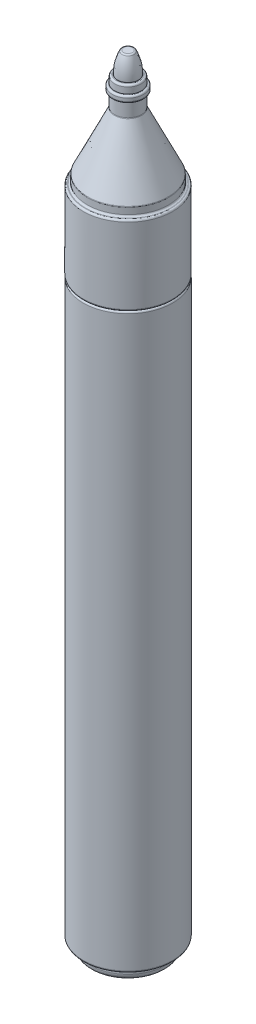
ISO-10303-21;
HEADER;
FILE_DESCRIPTION(('STEP AP214'),'2;1');
FILE_NAME('part.step','',(''),(''),'','','');
FILE_SCHEMA(('AUTOMOTIVE_DESIGN { 1 0 10303 214 1 1 1 1 }'));
ENDSEC;
DATA;
#1=APPLICATION_CONTEXT('core data for automotive mechanical design processes');
#2=APPLICATION_PROTOCOL_DEFINITION('international standard','automotive_design',2000,#1);
#3=PRODUCT_CONTEXT('',#1,'mechanical');
#4=PRODUCT('Part','Part','',(#3));
#5=PRODUCT_RELATED_PRODUCT_CATEGORY('part','',(#4));
#6=PRODUCT_DEFINITION_FORMATION('','',#4);
#7=PRODUCT_DEFINITION_CONTEXT('part definition',#1,'design');
#8=PRODUCT_DEFINITION('design','',#6,#7);
#9=PRODUCT_DEFINITION_SHAPE('','',#8);
#10=(LENGTH_UNIT() NAMED_UNIT(*) SI_UNIT(.MILLI.,.METRE.));
#11=(NAMED_UNIT(*) PLANE_ANGLE_UNIT() SI_UNIT($,.RADIAN.));
#12=(NAMED_UNIT(*) SI_UNIT($,.STERADIAN.) SOLID_ANGLE_UNIT());
#13=UNCERTAINTY_MEASURE_WITH_UNIT(LENGTH_MEASURE(1.E-05),#10,'distance_accuracy_value','');
#14=(GEOMETRIC_REPRESENTATION_CONTEXT(3) GLOBAL_UNCERTAINTY_ASSIGNED_CONTEXT((#13)) GLOBAL_UNIT_ASSIGNED_CONTEXT((#10,
#11,#12)) REPRESENTATION_CONTEXT('',''));
#15=CARTESIAN_POINT('',(0.,0.,0.));
#16=DIRECTION('',(0.,0.,1.));
#17=DIRECTION('',(1.,0.,0.));
#18=AXIS2_PLACEMENT_3D('',#15,#16,#17);
#19=CARTESIAN_POINT('',(0.,128.676956490786,0.));
#20=DIRECTION('',(0.,1.,0.));
#21=DIRECTION('',(0.,0.,1.));
#22=AXIS2_PLACEMENT_3D('',#19,#20,#21);
#23=PLANE('',#22);
#24=CARTESIAN_POINT('',(0.,128.676956490786,0.));
#25=DIRECTION('',(0.,1.,0.));
#26=DIRECTION('',(0.,0.,1.));
#27=AXIS2_PLACEMENT_3D('',#24,#25,#26);
#28=CIRCLE('',#27,0.732183424165414);
#29=CARTESIAN_POINT('',(0.,128.676956490786,0.732183424165414));
#30=VERTEX_POINT('',#29);
#31=EDGE_CURVE('E53',#30,#30,#28,.T.);
#32=ORIENTED_EDGE('',*,*,#31,.T.);
#33=EDGE_LOOP('',(#32));
#34=FACE_BOUND('',#33,.T.);
#35=ADVANCED_FACE('F42',(#34),#23,.T.);
#36=CARTESIAN_POINT('',(0.,96.,0.));
#37=DIRECTION('',(0.,-1.,0.));
#38=DIRECTION('',(0.,0.,-1.));
#39=AXIS2_PLACEMENT_3D('',#36,#37,#38);
#40=PLANE('',#39);
#41=CARTESIAN_POINT('',(0.,96.,0.));
#42=DIRECTION('',(0.,-1.,0.));
#43=DIRECTION('',(0.,0.,-1.));
#44=AXIS2_PLACEMENT_3D('',#41,#42,#43);
#45=CIRCLE('',#44,7.2);
#46=CARTESIAN_POINT('',(0.,96.,-7.2));
#47=VERTEX_POINT('',#46);
#48=EDGE_CURVE('E101',#47,#47,#45,.T.);
#49=ORIENTED_EDGE('',*,*,#48,.T.);
#50=EDGE_LOOP('',(#49));
#51=FACE_BOUND('',#50,.T.);
#52=ADVANCED_FACE('F183',(#51),#40,.T.);
#53=CARTESIAN_POINT('',(0.,96.,0.));
#54=DIRECTION('',(0.,-1.,0.));
#55=DIRECTION('',(0.,0.,-1.));
#56=AXIS2_PLACEMENT_3D('',#53,#54,#55);
#57=CYLINDRICAL_SURFACE('',#56,7.5);
#58=CARTESIAN_POINT('',(0.,108.986737814818,0.));
#59=DIRECTION('',(0.,1.,0.));
#60=DIRECTION('',(0.,0.,1.));
#61=AXIS2_PLACEMENT_3D('',#58,#59,#60);
#62=CIRCLE('',#61,7.5);
#63=CARTESIAN_POINT('',(0.,108.986737814818,7.5));
#64=VERTEX_POINT('',#63);
#65=EDGE_CURVE('E95',#64,#64,#62,.F.);
#66=ORIENTED_EDGE('',*,*,#65,.T.);
#67=EDGE_LOOP('',(#66));
#68=FACE_BOUND('',#67,.T.);
#69=CARTESIAN_POINT('',(0.,96.3,0.));
#70=DIRECTION('',(0.,-1.,0.));
#71=DIRECTION('',(0.,0.,-1.));
#72=AXIS2_PLACEMENT_3D('',#69,#70,#71);
#73=CIRCLE('',#72,7.5);
#74=CARTESIAN_POINT('',(0.,96.3,-7.5));
#75=VERTEX_POINT('',#74);
#76=EDGE_CURVE('E98',#75,#75,#73,.F.);
#77=ORIENTED_EDGE('',*,*,#76,.T.);
#78=EDGE_LOOP('',(#77));
#79=FACE_BOUND('',#78,.T.);
#80=ADVANCED_FACE('F179',(#68,#79),#57,.T.);
#81=CARTESIAN_POINT('',(7.5,109.286737814818,0.));
#82=DIRECTION('',(0.,1.,0.));
#83=DIRECTION('',(0.,0.,1.));
#84=AXIS2_PLACEMENT_3D('',#81,#82,#83);
#85=PLANE('',#84);
#86=CARTESIAN_POINT('',(0.,109.286737814818,0.));
#87=DIRECTION('',(0.,1.,0.));
#88=DIRECTION('',(0.,0.,1.));
#89=AXIS2_PLACEMENT_3D('',#86,#87,#88);
#90=CIRCLE('',#89,7.2);
#91=CARTESIAN_POINT('',(0.,109.286737814818,7.2));
#92=VERTEX_POINT('',#91);
#93=EDGE_CURVE('E89',#92,#92,#90,.T.);
#94=ORIENTED_EDGE('',*,*,#93,.T.);
#95=EDGE_LOOP('',(#94));
#96=FACE_BOUND('',#95,.T.);
#97=CARTESIAN_POINT('',(0.,109.286737814818,0.));
#98=DIRECTION('',(0.,1.,0.));
#99=DIRECTION('',(0.,0.,1.));
#100=AXIS2_PLACEMENT_3D('',#97,#98,#99);
#101=CIRCLE('',#100,7.09439131075038);
#102=CARTESIAN_POINT('',(0.,109.286737814818,7.09439131075038));
#103=VERTEX_POINT('',#102);
#104=EDGE_CURVE('E92',#103,#103,#101,.F.);
#105=ORIENTED_EDGE('',*,*,#104,.T.);
#106=EDGE_LOOP('',(#105));
#107=FACE_BOUND('',#106,.T.);
#108=ADVANCED_FACE('F175',(#96,#107),#85,.T.);
#109=CARTESIAN_POINT('',(0.,96.,0.));
#110=DIRECTION('',(0.,-1.,0.));
#111=DIRECTION('',(0.,0.,-1.));
#112=AXIS2_PLACEMENT_3D('',#109,#110,#111);
#113=CYLINDRICAL_SURFACE('',#112,6.79439131075038);
#114=CARTESIAN_POINT('',(0.,109.586737814818,0.));
#115=DIRECTION('',(0.,1.,0.));
#116=DIRECTION('',(0.,0.,1.));
#117=AXIS2_PLACEMENT_3D('',#114,#115,#116);
#118=CIRCLE('',#117,6.79439131075038);
#119=CARTESIAN_POINT('',(0.,109.586737814818,6.79439131075038));
#120=VERTEX_POINT('',#119);
#121=EDGE_CURVE('E83',#120,#120,#118,.T.);
#122=ORIENTED_EDGE('',*,*,#121,.T.);
#123=EDGE_LOOP('',(#122));
#124=FACE_BOUND('',#123,.T.);
#125=CARTESIAN_POINT('',(0.,110.648031964305,0.));
#126=DIRECTION('',(0.,1.,0.));
#127=DIRECTION('',(0.,0.,1.));
#128=AXIS2_PLACEMENT_3D('',#125,#126,#127);
#129=CIRCLE('',#128,6.79439131075038);
#130=CARTESIAN_POINT('',(0.,110.648031964305,6.79439131075038));
#131=VERTEX_POINT('',#130);
#132=EDGE_CURVE('E86',#131,#131,#129,.F.);
#133=ORIENTED_EDGE('',*,*,#132,.T.);
#134=EDGE_LOOP('',(#133));
#135=FACE_BOUND('',#134,.T.);
#136=ADVANCED_FACE('F171',(#124,#135),#113,.T.);
#137=CARTESIAN_POINT('',(0.,110.715390157732,0.));
#138=DIRECTION('',(0.,-1.,0.));
#139=DIRECTION('',(0.,0.,-1.));
#140=AXIS2_PLACEMENT_3D('',#137,#138,#139);
#141=CONICAL_SURFACE('',#140,6.79439131075038,0.441728970068027);
#142=CARTESIAN_POINT('',(0.,110.776282899163,0.));
#143=DIRECTION('',(0.,1.,0.));
#144=DIRECTION('',(0.,0.,1.));
#145=AXIS2_PLACEMENT_3D('',#142,#143,#144);
#146=CIRCLE('',#145,6.76559547315956);
#147=CARTESIAN_POINT('',(0.,110.776282899163,6.76559547315956));
#148=VERTEX_POINT('',#147);
#149=EDGE_CURVE('E77',#148,#148,#146,.T.);
#150=ORIENTED_EDGE('',*,*,#149,.T.);
#151=EDGE_LOOP('',(#150));
#152=FACE_BOUND('',#151,.T.);
#153=CARTESIAN_POINT('',(0.,120.295442190176,0.));
#154=DIRECTION('',(0.,-1.,0.));
#155=DIRECTION('',(0.,0.,-1.));
#156=AXIS2_PLACEMENT_3D('',#153,#154,#155);
#157=CIRCLE('',#156,2.2640381692862);
#158=CARTESIAN_POINT('',(0.,120.295442190176,-2.2640381692862));
#159=VERTEX_POINT('',#158);
#160=EDGE_CURVE('E80',#159,#159,#157,.T.);
#161=ORIENTED_EDGE('',*,*,#160,.T.);
#162=EDGE_LOOP('',(#161));
#163=FACE_BOUND('',#162,.T.);
#164=ADVANCED_FACE('F167',(#152,#163),#141,.T.);
#165=CARTESIAN_POINT('',(0.,96.,0.));
#166=DIRECTION('',(0.,-1.,0.));
#167=DIRECTION('',(0.,0.,-1.));
#168=AXIS2_PLACEMENT_3D('',#165,#166,#167);
#169=CYLINDRICAL_SURFACE('',#168,2.23524233169538);
#170=CARTESIAN_POINT('',(0.,120.423693125034,0.));
#171=DIRECTION('',(0.,-1.,0.));
#172=DIRECTION('',(0.,0.,-1.));
#173=AXIS2_PLACEMENT_3D('',#170,#171,#172);
#174=CIRCLE('',#173,2.23524233169538);
#175=CARTESIAN_POINT('',(0.,120.423693125034,-2.23524233169538));
#176=VERTEX_POINT('',#175);
#177=EDGE_CURVE('E74',#176,#176,#174,.F.);
#178=ORIENTED_EDGE('',*,*,#177,.T.);
#179=EDGE_LOOP('',(#178));
#180=FACE_BOUND('',#179,.T.);
#181=CARTESIAN_POINT('',(0.,122.754171915762,0.));
#182=DIRECTION('',(0.,-1.,0.));
#183=DIRECTION('',(0.,0.,-1.));
#184=AXIS2_PLACEMENT_3D('',#181,#182,#183);
#185=CIRCLE('',#184,2.23524233169538);
#186=CARTESIAN_POINT('',(0.,122.754171915762,-2.23524233169538));
#187=VERTEX_POINT('',#186);
#188=EDGE_CURVE('E104',#187,#187,#185,.T.);
#189=ORIENTED_EDGE('',*,*,#188,.T.);
#190=EDGE_LOOP('',(#189));
#191=FACE_BOUND('',#190,.T.);
#192=ADVANCED_FACE('F163',(#180,#191),#169,.T.);
#193=CARTESIAN_POINT('',(2.23524233169538,122.754171915762,0.));
#194=DIRECTION('',(0.,-1.,0.));
#195=DIRECTION('',(0.,0.,-1.));
#196=AXIS2_PLACEMENT_3D('',#193,#194,#195);
#197=PLANE('',#196);
#198=CARTESIAN_POINT('',(0.,122.754171915762,0.));
#199=DIRECTION('',(0.,-1.,0.));
#200=DIRECTION('',(0.,0.,-1.));
#201=AXIS2_PLACEMENT_3D('',#198,#199,#200);
#202=CIRCLE('',#201,2.33765852115577);
#203=CARTESIAN_POINT('',(0.,122.754171915762,-2.33765852115577));
#204=VERTEX_POINT('',#203);
#205=EDGE_CURVE('E71',#204,#204,#202,.T.);
#206=ORIENTED_EDGE('',*,*,#205,.T.);
#207=EDGE_LOOP('',(#206));
#208=FACE_BOUND('',#207,.T.);
#209=ORIENTED_EDGE('',*,*,#188,.F.);
#210=EDGE_LOOP('',(#209));
#211=FACE_BOUND('',#210,.T.);
#212=ADVANCED_FACE('F159',(#208,#211),#197,.T.);
#213=CARTESIAN_POINT('',(0.,96.,0.));
#214=DIRECTION('',(0.,-1.,0.));
#215=DIRECTION('',(0.,0.,-1.));
#216=AXIS2_PLACEMENT_3D('',#213,#214,#215);
#217=CYLINDRICAL_SURFACE('',#216,2.63765852115577);
#218=CARTESIAN_POINT('',(0.,123.054171915762,0.));
#219=DIRECTION('',(0.,-1.,0.));
#220=DIRECTION('',(0.,0.,-1.));
#221=AXIS2_PLACEMENT_3D('',#218,#219,#220);
#222=CIRCLE('',#221,2.63765852115577);
#223=CARTESIAN_POINT('',(0.,123.054171915762,-2.63765852115577));
#224=VERTEX_POINT('',#223);
#225=EDGE_CURVE('E65',#224,#224,#222,.F.);
#226=ORIENTED_EDGE('',*,*,#225,.T.);
#227=EDGE_LOOP('',(#226));
#228=FACE_BOUND('',#227,.T.);
#229=CARTESIAN_POINT('',(0.,123.559216575199,0.));
#230=DIRECTION('',(0.,1.,0.));
#231=DIRECTION('',(0.,0.,1.));
#232=AXIS2_PLACEMENT_3D('',#229,#230,#231);
#233=CIRCLE('',#232,2.63765852115577);
#234=CARTESIAN_POINT('',(0.,123.559216575199,2.63765852115577));
#235=VERTEX_POINT('',#234);
#236=EDGE_CURVE('E68',#235,#235,#233,.F.);
#237=ORIENTED_EDGE('',*,*,#236,.T.);
#238=EDGE_LOOP('',(#237));
#239=FACE_BOUND('',#238,.T.);
#240=ADVANCED_FACE('F155',(#228,#239),#217,.T.);
#241=CARTESIAN_POINT('',(2.63765852115577,123.859216575199,0.));
#242=DIRECTION('',(0.,1.,0.));
#243=DIRECTION('',(0.,0.,1.));
#244=AXIS2_PLACEMENT_3D('',#241,#242,#243);
#245=PLANE('',#244);
#246=CARTESIAN_POINT('',(0.,123.859216575199,0.));
#247=DIRECTION('',(0.,1.,0.));
#248=DIRECTION('',(0.,0.,1.));
#249=AXIS2_PLACEMENT_3D('',#246,#247,#248);
#250=CIRCLE('',#249,2.33765852115577);
#251=CARTESIAN_POINT('',(0.,123.859216575199,2.33765852115577));
#252=VERTEX_POINT('',#251);
#253=EDGE_CURVE('E62',#252,#252,#250,.T.);
#254=ORIENTED_EDGE('',*,*,#253,.T.);
#255=EDGE_LOOP('',(#254));
#256=FACE_BOUND('',#255,.T.);
#257=CARTESIAN_POINT('',(0.,123.859216575199,0.));
#258=DIRECTION('',(0.,-1.,0.));
#259=DIRECTION('',(0.,0.,-1.));
#260=AXIS2_PLACEMENT_3D('',#257,#258,#259);
#261=CIRCLE('',#260,2.23524233169538);
#262=CARTESIAN_POINT('',(0.,123.859216575199,-2.23524233169538));
#263=VERTEX_POINT('',#262);
#264=EDGE_CURVE('E107',#263,#263,#261,.T.);
#265=ORIENTED_EDGE('',*,*,#264,.T.);
#266=EDGE_LOOP('',(#265));
#267=FACE_BOUND('',#266,.T.);
#268=ADVANCED_FACE('F152',(#256,#267),#245,.T.);
#269=CARTESIAN_POINT('',(0.,96.,0.));
#270=DIRECTION('',(0.,-1.,0.));
#271=DIRECTION('',(0.,0.,-1.));
#272=AXIS2_PLACEMENT_3D('',#269,#270,#271);
#273=CYLINDRICAL_SURFACE('',#272,2.23524233169538);
#274=CARTESIAN_POINT('',(0.,124.887686929379,0.));
#275=DIRECTION('',(0.,1.,0.));
#276=DIRECTION('',(0.,0.,1.));
#277=AXIS2_PLACEMENT_3D('',#274,#275,#276);
#278=CIRCLE('',#277,2.23524233169538);
#279=CARTESIAN_POINT('',(0.,124.887686929379,2.23524233169538));
#280=VERTEX_POINT('',#279);
#281=EDGE_CURVE('E49',#280,#280,#278,.F.);
#282=ORIENTED_EDGE('',*,*,#281,.T.);
#283=EDGE_LOOP('',(#282));
#284=FACE_BOUND('',#283,.T.);
#285=ORIENTED_EDGE('',*,*,#264,.F.);
#286=EDGE_LOOP('',(#285));
#287=FACE_BOUND('',#286,.T.);
#288=ADVANCED_FACE('F149',(#284,#287),#273,.T.);
#289=CARTESIAN_POINT('',(2.23524233169538,125.187686929379,0.));
#290=DIRECTION('',(0.,1.,0.));
#291=DIRECTION('',(0.,0.,1.));
#292=AXIS2_PLACEMENT_3D('',#289,#290,#291);
#293=PLANE('',#292);
#294=CARTESIAN_POINT('',(0.,125.187686929379,0.));
#295=DIRECTION('',(0.,1.,0.));
#296=DIRECTION('',(0.,0.,1.));
#297=AXIS2_PLACEMENT_3D('',#294,#295,#296);
#298=CIRCLE('',#297,1.93524233169538);
#299=CARTESIAN_POINT('',(0.,125.187686929379,1.93524233169538));
#300=VERTEX_POINT('',#299);
#301=EDGE_CURVE('E11',#300,#300,#298,.T.);
#302=ORIENTED_EDGE('',*,*,#301,.T.);
#303=EDGE_LOOP('',(#302));
#304=FACE_BOUND('',#303,.T.);
#305=CARTESIAN_POINT('',(0.,125.187686929379,0.));
#306=DIRECTION('',(0.,-1.,0.));
#307=DIRECTION('',(0.,0.,-1.));
#308=AXIS2_PLACEMENT_3D('',#305,#306,#307);
#309=CIRCLE('',#308,1.77215292040047);
#310=CARTESIAN_POINT('',(0.,125.187686929379,-1.77215292040047));
#311=VERTEX_POINT('',#310);
#312=EDGE_CURVE('E110',#311,#311,#309,.T.);
#313=ORIENTED_EDGE('',*,*,#312,.T.);
#314=EDGE_LOOP('',(#313));
#315=FACE_BOUND('',#314,.T.);
#316=ADVANCED_FACE('F145',(#304,#315),#293,.T.);
#317=CARTESIAN_POINT('',(0.,96.,0.));
#318=DIRECTION('',(0.,-1.,0.));
#319=DIRECTION('',(0.,0.,-1.));
#320=AXIS2_PLACEMENT_3D('',#317,#318,#319);
#321=CYLINDRICAL_SURFACE('',#320,1.77215292040047);
#322=CARTESIAN_POINT('',(0.,124.527585577157,0.));
#323=DIRECTION('',(0.,-1.,0.));
#324=DIRECTION('',(0.,0.,-1.));
#325=AXIS2_PLACEMENT_3D('',#322,#323,#324);
#326=CIRCLE('',#325,1.77215292040047);
#327=CARTESIAN_POINT('',(0.,124.527585577157,-1.77215292040047));
#328=VERTEX_POINT('',#327);
#329=EDGE_CURVE('E113',#328,#328,#326,.T.);
#330=ORIENTED_EDGE('',*,*,#329,.T.);
#331=EDGE_LOOP('',(#330));
#332=FACE_BOUND('',#331,.T.);
#333=ORIENTED_EDGE('',*,*,#312,.F.);
#334=EDGE_LOOP('',(#333));
#335=FACE_BOUND('',#334,.T.);
#336=ADVANCED_FACE('F141',(#332,#335),#321,.F.);
#337=CARTESIAN_POINT('',(1.71169839944116,124.527585577157,0.));
#338=DIRECTION('',(0.,1.,0.));
#339=DIRECTION('',(0.,0.,1.));
#340=AXIS2_PLACEMENT_3D('',#337,#338,#339);
#341=PLANE('',#340);
#342=CARTESIAN_POINT('',(0.,124.527585577157,0.));
#343=DIRECTION('',(0.,-1.,0.));
#344=DIRECTION('',(0.,0.,-1.));
#345=AXIS2_PLACEMENT_3D('',#342,#343,#344);
#346=CIRCLE('',#345,1.71169839944116);
#347=CARTESIAN_POINT('',(0.,124.527585577157,-1.71169839944116));
#348=VERTEX_POINT('',#347);
#349=EDGE_CURVE('E116',#348,#348,#346,.T.);
#350=ORIENTED_EDGE('',*,*,#349,.T.);
#351=EDGE_LOOP('',(#350));
#352=FACE_BOUND('',#351,.T.);
#353=ORIENTED_EDGE('',*,*,#329,.F.);
#354=EDGE_LOOP('',(#353));
#355=FACE_BOUND('',#354,.T.);
#356=ADVANCED_FACE('F137',(#352,#355),#341,.T.);
#357=CARTESIAN_POINT('',(0.,96.,0.));
#358=DIRECTION('',(0.,-1.,0.));
#359=DIRECTION('',(0.,0.,-1.));
#360=AXIS2_PLACEMENT_3D('',#357,#358,#359);
#361=CYLINDRICAL_SURFACE('',#360,1.71169839944116);
#362=CARTESIAN_POINT('',(0.,125.187686929379,0.));
#363=DIRECTION('',(0.,-1.,0.));
#364=DIRECTION('',(0.,0.,-1.));
#365=AXIS2_PLACEMENT_3D('',#362,#363,#364);
#366=CIRCLE('',#365,1.71169839944116);
#367=CARTESIAN_POINT('',(0.,125.187686929379,-1.71169839944116));
#368=VERTEX_POINT('',#367);
#369=EDGE_CURVE('E119',#368,#368,#366,.T.);
#370=ORIENTED_EDGE('',*,*,#369,.T.);
#371=EDGE_LOOP('',(#370));
#372=FACE_BOUND('',#371,.T.);
#373=ORIENTED_EDGE('',*,*,#349,.F.);
#374=EDGE_LOOP('',(#373));
#375=FACE_BOUND('',#374,.T.);
#376=ADVANCED_FACE('F133',(#372,#375),#361,.T.);
#377=CARTESIAN_POINT('',(1.71169839944116,125.187686929379,0.));
#378=CARTESIAN_POINT('',(1.75693190432987,126.488456162657,0.));
#379=CARTESIAN_POINT('',(1.48976738983345,127.651546016572,0.));
#380=CARTESIAN_POINT('',(0.91020485614761,128.676956490786,0.));
#381=B_SPLINE_CURVE_WITH_KNOTS('',3,(#377,#378,#379,#380),.UNSPECIFIED.,.F.,.F.,(4,4),
(0.298630267274512,1.),.UNSPECIFIED.);
#382=CARTESIAN_POINT('',(0.,96.,0.));
#383=DIRECTION('',(0.,-1.,0.));
#384=AXIS1_PLACEMENT('',#382,#383);
#385=SURFACE_OF_REVOLUTION('',#381,#384);
#386=CARTESIAN_POINT('',(0.,128.516690073587,0.));
#387=DIRECTION('',(0.,-1.,0.));
#388=DIRECTION('',(0.,0.,-1.));
#389=AXIS2_PLACEMENT_3D('',#386,#387,#388);
#390=CIRCLE('',#389,0.997653810155341);
#391=CARTESIAN_POINT('',(0.,128.516690073587,-0.997653810155341));
#392=VERTEX_POINT('',#391);
#393=EDGE_CURVE('E57',#392,#392,#390,.T.);
#394=ORIENTED_EDGE('',*,*,#393,.T.);
#395=EDGE_LOOP('',(#394));
#396=FACE_BOUND('',#395,.T.);
#397=ORIENTED_EDGE('',*,*,#369,.F.);
#398=EDGE_LOOP('',(#397));
#399=FACE_BOUND('',#398,.T.);
#400=ADVANCED_FACE('F129',(#396,#399),#385,.F.);
#401=CARTESIAN_POINT('',(0.,96.3,0.));
#402=DIRECTION('',(0.,-1.,0.));
#403=DIRECTION('',(0.,0.,-1.));
#404=AXIS2_PLACEMENT_3D('',#401,#402,#403);
#405=TOROIDAL_SURFACE('',#404,7.2,0.3);
#406=ORIENTED_EDGE('',*,*,#76,.F.);
#407=EDGE_LOOP('',(#406));
#408=FACE_BOUND('',#407,.T.);
#409=ORIENTED_EDGE('',*,*,#48,.F.);
#410=EDGE_LOOP('',(#409));
#411=FACE_BOUND('',#410,.T.);
#412=ADVANCED_FACE('F132',(#408,#411),#405,.T.);
#413=CARTESIAN_POINT('',(0.,108.986737814818,0.));
#414=DIRECTION('',(0.,1.,0.));
#415=DIRECTION('',(0.,0.,1.));
#416=AXIS2_PLACEMENT_3D('',#413,#414,#415);
#417=TOROIDAL_SURFACE('',#416,7.2,0.3);
#418=ORIENTED_EDGE('',*,*,#93,.F.);
#419=EDGE_LOOP('',(#418));
#420=FACE_BOUND('',#419,.T.);
#421=ORIENTED_EDGE('',*,*,#65,.F.);
#422=EDGE_LOOP('',(#421));
#423=FACE_BOUND('',#422,.T.);
#424=ADVANCED_FACE('F193',(#420,#423),#417,.T.);
#425=CARTESIAN_POINT('',(0.,109.586737814818,0.));
#426=DIRECTION('',(0.,1.,0.));
#427=DIRECTION('',(0.,0.,1.));
#428=AXIS2_PLACEMENT_3D('',#425,#426,#427);
#429=TOROIDAL_SURFACE('',#428,7.09439131075038,0.3);
#430=ORIENTED_EDGE('',*,*,#121,.F.);
#431=EDGE_LOOP('',(#430));
#432=FACE_BOUND('',#431,.T.);
#433=ORIENTED_EDGE('',*,*,#104,.F.);
#434=EDGE_LOOP('',(#433));
#435=FACE_BOUND('',#434,.T.);
#436=ADVANCED_FACE('F197',(#432,#435),#429,.F.);
#437=CARTESIAN_POINT('',(0.,110.648031964305,0.));
#438=DIRECTION('',(0.,1.,0.));
#439=DIRECTION('',(0.,0.,1.));
#440=AXIS2_PLACEMENT_3D('',#437,#438,#439);
#441=TOROIDAL_SURFACE('',#440,6.49439131075038,0.3);
#442=ORIENTED_EDGE('',*,*,#149,.F.);
#443=EDGE_LOOP('',(#442));
#444=FACE_BOUND('',#443,.T.);
#445=ORIENTED_EDGE('',*,*,#132,.F.);
#446=EDGE_LOOP('',(#445));
#447=FACE_BOUND('',#446,.T.);
#448=ADVANCED_FACE('F201',(#444,#447),#441,.T.);
#449=CARTESIAN_POINT('',(0.,120.423693125034,0.));
#450=DIRECTION('',(0.,-1.,0.));
#451=DIRECTION('',(0.,0.,-1.));
#452=AXIS2_PLACEMENT_3D('',#449,#450,#451);
#453=TOROIDAL_SURFACE('',#452,2.53524233169538,0.3);
#454=ORIENTED_EDGE('',*,*,#177,.F.);
#455=EDGE_LOOP('',(#454));
#456=FACE_BOUND('',#455,.T.);
#457=ORIENTED_EDGE('',*,*,#160,.F.);
#458=EDGE_LOOP('',(#457));
#459=FACE_BOUND('',#458,.T.);
#460=ADVANCED_FACE('F205',(#456,#459),#453,.F.);
#461=CARTESIAN_POINT('',(0.,123.054171915762,0.));
#462=DIRECTION('',(0.,-1.,0.));
#463=DIRECTION('',(0.,0.,-1.));
#464=AXIS2_PLACEMENT_3D('',#461,#462,#463);
#465=TOROIDAL_SURFACE('',#464,2.33765852115577,0.3);
#466=ORIENTED_EDGE('',*,*,#225,.F.);
#467=EDGE_LOOP('',(#466));
#468=FACE_BOUND('',#467,.T.);
#469=ORIENTED_EDGE('',*,*,#205,.F.);
#470=EDGE_LOOP('',(#469));
#471=FACE_BOUND('',#470,.T.);
#472=ADVANCED_FACE('F209',(#468,#471),#465,.T.);
#473=CARTESIAN_POINT('',(0.,123.559216575199,0.));
#474=DIRECTION('',(0.,1.,0.));
#475=DIRECTION('',(0.,0.,1.));
#476=AXIS2_PLACEMENT_3D('',#473,#474,#475);
#477=TOROIDAL_SURFACE('',#476,2.33765852115577,0.3);
#478=ORIENTED_EDGE('',*,*,#253,.F.);
#479=EDGE_LOOP('',(#478));
#480=FACE_BOUND('',#479,.T.);
#481=ORIENTED_EDGE('',*,*,#236,.F.);
#482=EDGE_LOOP('',(#481));
#483=FACE_BOUND('',#482,.T.);
#484=ADVANCED_FACE('F213',(#480,#483),#477,.T.);
#485=CARTESIAN_POINT('',(0.,128.376956490786,0.));
#486=DIRECTION('',(0.,-1.,0.));
#487=DIRECTION('',(0.,0.,-1.));
#488=AXIS2_PLACEMENT_3D('',#485,#486,#487);
#489=TOROIDAL_SURFACE('',#488,0.732183424165414,0.3);
#490=ORIENTED_EDGE('',*,*,#31,.F.);
#491=EDGE_LOOP('',(#490));
#492=FACE_BOUND('',#491,.T.);
#493=ORIENTED_EDGE('',*,*,#393,.F.);
#494=EDGE_LOOP('',(#493));
#495=FACE_BOUND('',#494,.T.);
#496=ADVANCED_FACE('F216',(#492,#495),#489,.T.);
#497=CARTESIAN_POINT('',(0.,124.887686929379,0.));
#498=DIRECTION('',(0.,1.,0.));
#499=DIRECTION('',(0.,0.,1.));
#500=AXIS2_PLACEMENT_3D('',#497,#498,#499);
#501=TOROIDAL_SURFACE('',#500,1.93524233169538,0.3);
#502=ORIENTED_EDGE('',*,*,#301,.F.);
#503=EDGE_LOOP('',(#502));
#504=FACE_BOUND('',#503,.T.);
#505=ORIENTED_EDGE('',*,*,#281,.F.);
#506=EDGE_LOOP('',(#505));
#507=FACE_BOUND('',#506,.T.);
#508=ADVANCED_FACE('F44',(#504,#507),#501,.T.);
#509=CLOSED_SHELL('',(#35,#52,#80,#108,#136,#164,#192,#212,#240,#268,#288,#316,#336,#356,#376,
#400,#412,#424,#436,#448,#460,#472,#484,#496,#508));
#510=MANIFOLD_SOLID_BREP('B2',#509);
#511=CARTESIAN_POINT('',(0.,96.,0.));
#512=DIRECTION('',(0.,-1.,0.));
#513=DIRECTION('',(0.,0.,-1.));
#514=AXIS2_PLACEMENT_3D('',#511,#512,#513);
#515=CYLINDRICAL_SURFACE('',#514,7.5);
#516=CARTESIAN_POINT('',(0.,0.299999999999995,0.));
#517=DIRECTION('',(0.,1.,0.));
#518=DIRECTION('',(0.,0.,1.));
#519=AXIS2_PLACEMENT_3D('',#516,#517,#518);
#520=CIRCLE('',#519,7.5);
#521=CARTESIAN_POINT('',(0.,0.299999999999995,7.5));
#522=VERTEX_POINT('',#521);
#523=EDGE_CURVE('E459',#522,#522,#520,.T.);
#524=ORIENTED_EDGE('',*,*,#523,.T.);
#525=EDGE_LOOP('',(#524));
#526=FACE_BOUND('',#525,.T.);
#527=CARTESIAN_POINT('',(0.,95.7,0.));
#528=DIRECTION('',(0.,1.,0.));
#529=DIRECTION('',(0.,0.,1.));
#530=AXIS2_PLACEMENT_3D('',#527,#528,#529);
#531=CIRCLE('',#530,7.5);
#532=CARTESIAN_POINT('',(0.,95.7,7.5));
#533=VERTEX_POINT('',#532);
#534=EDGE_CURVE('E462',#533,#533,#531,.F.);
#535=ORIENTED_EDGE('',*,*,#534,.T.);
#536=EDGE_LOOP('',(#535));
#537=FACE_BOUND('',#536,.T.);
#538=ADVANCED_FACE('F436',(#526,#537),#515,.T.);
#539=CARTESIAN_POINT('',(0.,96.,0.));
#540=DIRECTION('',(0.,1.,0.));
#541=DIRECTION('',(0.,0.,1.));
#542=AXIS2_PLACEMENT_3D('',#539,#540,#541);
#543=PLANE('',#542);
#544=CARTESIAN_POINT('',(0.,96.,0.));
#545=DIRECTION('',(0.,1.,0.));
#546=DIRECTION('',(0.,0.,1.));
#547=AXIS2_PLACEMENT_3D('',#544,#545,#546);
#548=CIRCLE('',#547,7.2);
#549=CARTESIAN_POINT('',(0.,96.,7.2));
#550=VERTEX_POINT('',#549);
#551=EDGE_CURVE('E451',#550,#550,#548,.T.);
#552=ORIENTED_EDGE('',*,*,#551,.T.);
#553=EDGE_LOOP('',(#552));
#554=FACE_BOUND('',#553,.T.);
#555=ADVANCED_FACE('F474',(#554),#543,.T.);
#556=CARTESIAN_POINT('',(0.,0.,0.));
#557=DIRECTION('',(0.,1.,0.));
#558=DIRECTION('',(0.,0.,1.));
#559=AXIS2_PLACEMENT_3D('',#556,#557,#558);
#560=PLANE('',#559);
#561=CARTESIAN_POINT('',(0.,0.,0.));
#562=DIRECTION('',(0.,1.,0.));
#563=DIRECTION('',(0.,0.,1.));
#564=AXIS2_PLACEMENT_3D('',#561,#562,#563);
#565=CIRCLE('',#564,6.34953222087195);
#566=CARTESIAN_POINT('',(0.,0.,6.34953222087195));
#567=VERTEX_POINT('',#566);
#568=EDGE_CURVE('E447',#567,#567,#565,.F.);
#569=ORIENTED_EDGE('',*,*,#568,.F.);
#570=EDGE_LOOP('',(#569));
#571=FACE_BOUND('',#570,.T.);
#572=CARTESIAN_POINT('',(0.,0.,0.));
#573=DIRECTION('',(0.,1.,0.));
#574=DIRECTION('',(0.,0.,1.));
#575=AXIS2_PLACEMENT_3D('',#572,#573,#574);
#576=CIRCLE('',#575,7.2);
#577=CARTESIAN_POINT('',(0.,0.,7.2));
#578=VERTEX_POINT('',#577);
#579=EDGE_CURVE('E456',#578,#578,#576,.F.);
#580=ORIENTED_EDGE('',*,*,#579,.T.);
#581=EDGE_LOOP('',(#580));
#582=FACE_BOUND('',#581,.T.);
#583=ADVANCED_FACE('F476',(#571,#582),#560,.F.);
#584=CARTESIAN_POINT('',(0.,0.299999999999995,0.));
#585=DIRECTION('',(0.,1.,0.));
#586=DIRECTION('',(0.,0.,1.));
#587=AXIS2_PLACEMENT_3D('',#584,#585,#586);
#588=TOROIDAL_SURFACE('',#587,7.2,0.3);
#589=ORIENTED_EDGE('',*,*,#579,.F.);
#590=EDGE_LOOP('',(#589));
#591=FACE_BOUND('',#590,.T.);
#592=ORIENTED_EDGE('',*,*,#523,.F.);
#593=EDGE_LOOP('',(#592));
#594=FACE_BOUND('',#593,.T.);
#595=ADVANCED_FACE('F471',(#591,#594),#588,.T.);
#596=CARTESIAN_POINT('',(0.,95.7,0.));
#597=DIRECTION('',(0.,1.,0.));
#598=DIRECTION('',(0.,0.,1.));
#599=AXIS2_PLACEMENT_3D('',#596,#597,#598);
#600=TOROIDAL_SURFACE('',#599,7.2,0.3);
#601=ORIENTED_EDGE('',*,*,#534,.F.);
#602=EDGE_LOOP('',(#601));
#603=FACE_BOUND('',#602,.T.);
#604=ORIENTED_EDGE('',*,*,#551,.F.);
#605=EDGE_LOOP('',(#604));
#606=FACE_BOUND('',#605,.T.);
#607=ADVANCED_FACE('F467',(#603,#606),#600,.T.);
#608=CARTESIAN_POINT('',(0.,-2.,0.));
#609=DIRECTION('',(0.,1.,0.));
#610=DIRECTION('',(0.,0.,1.));
#611=AXIS2_PLACEMENT_3D('',#608,#609,#610);
#612=CYLINDRICAL_SURFACE('',#611,6.34953222087195);
#613=CARTESIAN_POINT('',(0.,-1.,0.));
#614=DIRECTION('',(0.,-1.,0.));
#615=DIRECTION('',(0.,0.,-1.));
#616=AXIS2_PLACEMENT_3D('',#613,#614,#615);
#617=CIRCLE('',#616,6.34953222087195);
#618=CARTESIAN_POINT('',(0.,-1.,-6.34953222087195));
#619=VERTEX_POINT('',#618);
#620=EDGE_CURVE('E41',#619,#619,#617,.F.);
#621=ORIENTED_EDGE('',*,*,#620,.T.);
#622=EDGE_LOOP('',(#621));
#623=FACE_BOUND('',#622,.T.);
#624=ORIENTED_EDGE('',*,*,#568,.T.);
#625=EDGE_LOOP('',(#624));
#626=FACE_BOUND('',#625,.T.);
#627=ADVANCED_FACE('F470',(#623,#626),#612,.T.);
#628=CARTESIAN_POINT('',(0.,-2.,0.));
#629=DIRECTION('',(0.,-1.,0.));
#630=DIRECTION('',(0.,0.,-1.));
#631=AXIS2_PLACEMENT_3D('',#628,#629,#630);
#632=PLANE('',#631);
#633=CARTESIAN_POINT('',(0.,-2.,0.));
#634=DIRECTION('',(0.,-1.,0.));
#635=DIRECTION('',(0.,0.,-1.));
#636=AXIS2_PLACEMENT_3D('',#633,#634,#635);
#637=CIRCLE('',#636,5.34953222087195);
#638=CARTESIAN_POINT('',(0.,-2.,-5.34953222087195));
#639=VERTEX_POINT('',#638);
#640=EDGE_CURVE('E443',#639,#639,#637,.T.);
#641=ORIENTED_EDGE('',*,*,#640,.T.);
#642=EDGE_LOOP('',(#641));
#643=FACE_BOUND('',#642,.T.);
#644=ADVANCED_FACE('F509',(#643),#632,.T.);
#645=CARTESIAN_POINT('',(0.,-1.,0.));
#646=DIRECTION('',(0.,-1.,0.));
#647=DIRECTION('',(0.,0.,-1.));
#648=AXIS2_PLACEMENT_3D('',#645,#646,#647);
#649=TOROIDAL_SURFACE('',#648,5.34953222087195,1.);
#650=ORIENTED_EDGE('',*,*,#620,.F.);
#651=EDGE_LOOP('',(#650));
#652=FACE_BOUND('',#651,.T.);
#653=ORIENTED_EDGE('',*,*,#640,.F.);
#654=EDGE_LOOP('',(#653));
#655=FACE_BOUND('',#654,.T.);
#656=ADVANCED_FACE('F438',(#652,#655),#649,.T.);
#657=CLOSED_SHELL('',(#538,#555,#583,#595,#607,#627,#644,#656));
#658=MANIFOLD_SOLID_BREP('B6',#657);
#659=ADVANCED_BREP_SHAPE_REPRESENTATION('',(#18,#510,#658),#14);
#660=SHAPE_DEFINITION_REPRESENTATION(#9,#659);
ENDSEC;
END-ISO-10303-21;
